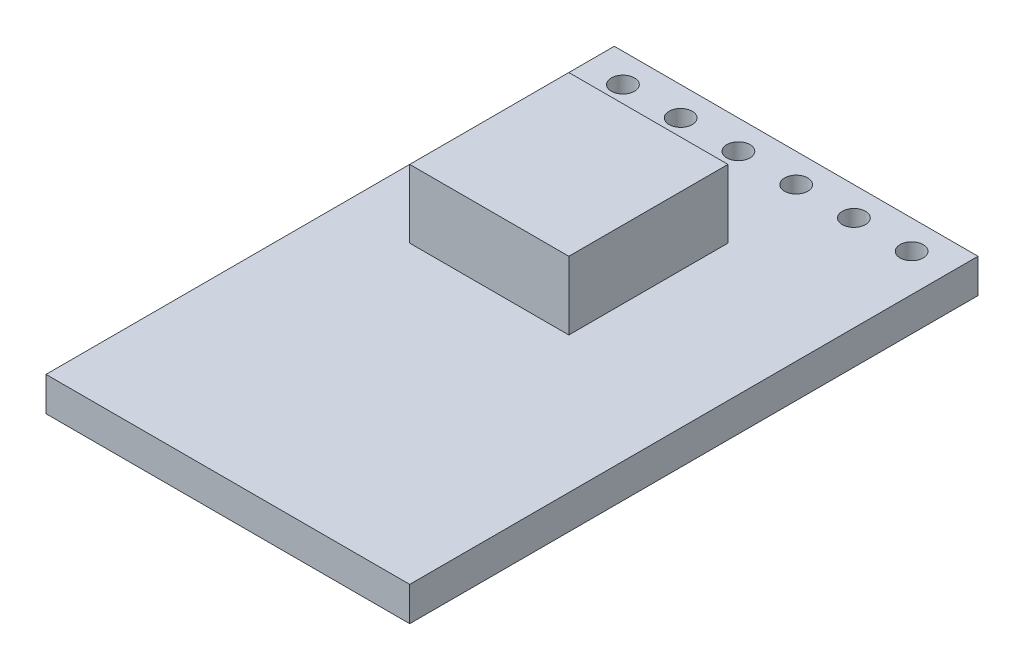
ISO-10303-21;
HEADER;
FILE_DESCRIPTION(('STEP AP214'),'2;1');
FILE_NAME('part.step','',(''),(''),'','','');
FILE_SCHEMA(('AUTOMOTIVE_DESIGN { 1 0 10303 214 1 1 1 1 }'));
ENDSEC;
DATA;
#1=APPLICATION_CONTEXT('core data for automotive mechanical design processes');
#2=APPLICATION_PROTOCOL_DEFINITION('international standard','automotive_design',2000,#1);
#3=PRODUCT_CONTEXT('',#1,'mechanical');
#4=PRODUCT('Part','Part','',(#3));
#5=PRODUCT_RELATED_PRODUCT_CATEGORY('part','',(#4));
#6=PRODUCT_DEFINITION_FORMATION('','',#4);
#7=PRODUCT_DEFINITION_CONTEXT('part definition',#1,'design');
#8=PRODUCT_DEFINITION('design','',#6,#7);
#9=PRODUCT_DEFINITION_SHAPE('','',#8);
#10=(LENGTH_UNIT() NAMED_UNIT(*) SI_UNIT(.MILLI.,.METRE.));
#11=(NAMED_UNIT(*) PLANE_ANGLE_UNIT() SI_UNIT($,.RADIAN.));
#12=(NAMED_UNIT(*) SI_UNIT($,.STERADIAN.) SOLID_ANGLE_UNIT());
#13=UNCERTAINTY_MEASURE_WITH_UNIT(LENGTH_MEASURE(1.E-05),#10,'distance_accuracy_value','');
#14=(GEOMETRIC_REPRESENTATION_CONTEXT(3) GLOBAL_UNCERTAINTY_ASSIGNED_CONTEXT((#13)) GLOBAL_UNIT_ASSIGNED_CONTEXT((#10,
#11,#12)) REPRESENTATION_CONTEXT('',''));
#15=CARTESIAN_POINT('',(0.,0.,0.));
#16=DIRECTION('',(0.,0.,1.));
#17=DIRECTION('',(1.,0.,0.));
#18=AXIS2_PLACEMENT_3D('',#15,#16,#17);
#19=CARTESIAN_POINT('',(0.,1.5,0.));
#20=DIRECTION('',(0.,1.,0.));
#21=DIRECTION('',(0.,0.,1.));
#22=AXIS2_PLACEMENT_3D('',#19,#20,#21);
#23=PLANE('',#22);
#24=CARTESIAN_POINT('',(-14.35,1.5,-23.73));
#25=DIRECTION('',(0.,1.,0.));
#26=DIRECTION('',(0.,0.,1.));
#27=AXIS2_PLACEMENT_3D('',#24,#25,#26);
#28=CIRCLE('',#27,0.51);
#29=CARTESIAN_POINT('',(-14.35,1.5,-23.22));
#30=VERTEX_POINT('',#29);
#31=EDGE_CURVE('E148',#30,#30,#28,.T.);
#32=ORIENTED_EDGE('',*,*,#31,.F.);
#33=EDGE_LOOP('',(#32));
#34=FACE_BOUND('',#33,.T.);
#35=CARTESIAN_POINT('',(-11.81,1.5,-23.73));
#36=DIRECTION('',(0.,1.,0.));
#37=DIRECTION('',(0.,0.,1.));
#38=AXIS2_PLACEMENT_3D('',#35,#36,#37);
#39=CIRCLE('',#38,0.51);
#40=CARTESIAN_POINT('',(-11.81,1.5,-23.22));
#41=VERTEX_POINT('',#40);
#42=EDGE_CURVE('E151',#41,#41,#39,.T.);
#43=ORIENTED_EDGE('',*,*,#42,.F.);
#44=EDGE_LOOP('',(#43));
#45=FACE_BOUND('',#44,.T.);
#46=CARTESIAN_POINT('',(-9.27,1.5,-23.73));
#47=DIRECTION('',(0.,1.,0.));
#48=DIRECTION('',(0.,0.,1.));
#49=AXIS2_PLACEMENT_3D('',#46,#47,#48);
#50=CIRCLE('',#49,0.51);
#51=CARTESIAN_POINT('',(-9.27,1.5,-23.22));
#52=VERTEX_POINT('',#51);
#53=EDGE_CURVE('E157',#52,#52,#50,.T.);
#54=ORIENTED_EDGE('',*,*,#53,.F.);
#55=EDGE_LOOP('',(#54));
#56=FACE_BOUND('',#55,.T.);
#57=CARTESIAN_POINT('',(-6.73,1.5,-23.73));
#58=DIRECTION('',(0.,1.,0.));
#59=DIRECTION('',(0.,0.,1.));
#60=AXIS2_PLACEMENT_3D('',#57,#58,#59);
#61=CIRCLE('',#60,0.51);
#62=CARTESIAN_POINT('',(-6.73,1.5,-23.22));
#63=VERTEX_POINT('',#62);
#64=EDGE_CURVE('E163',#63,#63,#61,.T.);
#65=ORIENTED_EDGE('',*,*,#64,.F.);
#66=EDGE_LOOP('',(#65));
#67=FACE_BOUND('',#66,.T.);
#68=CARTESIAN_POINT('',(-4.19,1.5,-23.73));
#69=DIRECTION('',(0.,1.,0.));
#70=DIRECTION('',(0.,0.,1.));
#71=AXIS2_PLACEMENT_3D('',#68,#69,#70);
#72=CIRCLE('',#71,0.509999999999999);
#73=CARTESIAN_POINT('',(-4.19,1.5,-23.22));
#74=VERTEX_POINT('',#73);
#75=EDGE_CURVE('E169',#74,#74,#72,.T.);
#76=ORIENTED_EDGE('',*,*,#75,.F.);
#77=EDGE_LOOP('',(#76));
#78=FACE_BOUND('',#77,.T.);
#79=CARTESIAN_POINT('',(-1.65,1.5,-23.73));
#80=DIRECTION('',(0.,1.,0.));
#81=DIRECTION('',(0.,0.,1.));
#82=AXIS2_PLACEMENT_3D('',#79,#80,#81);
#83=CIRCLE('',#82,0.509999999999998);
#84=CARTESIAN_POINT('',(-1.65,1.5,-23.22));
#85=VERTEX_POINT('',#84);
#86=EDGE_CURVE('E139',#85,#85,#83,.T.);
#87=ORIENTED_EDGE('',*,*,#86,.F.);
#88=EDGE_LOOP('',(#87));
#89=FACE_BOUND('',#88,.T.);
#90=DIRECTION('',(0.,0.,-1.));
#91=VECTOR('',#90,1.);
#92=CARTESIAN_POINT('',(0.,1.5,0.));
#93=LINE('',#92,#91);
#94=CARTESIAN_POINT('',(0.,1.5,0.));
#95=VERTEX_POINT('',#94);
#96=CARTESIAN_POINT('',(0.,1.5,-25.));
#97=VERTEX_POINT('',#96);
#98=EDGE_CURVE('E177',#95,#97,#93,.T.);
#99=ORIENTED_EDGE('',*,*,#98,.T.);
#100=DIRECTION('',(-1.,0.,0.));
#101=VECTOR('',#100,1.);
#102=CARTESIAN_POINT('',(0.,1.5,-25.));
#103=LINE('',#102,#101);
#104=CARTESIAN_POINT('',(-16.,1.5,-25.));
#105=VERTEX_POINT('',#104);
#106=EDGE_CURVE('E89',#97,#105,#103,.T.);
#107=ORIENTED_EDGE('',*,*,#106,.T.);
#108=DIRECTION('',(0.,0.,1.));
#109=VECTOR('',#108,1.);
#110=CARTESIAN_POINT('',(-16.,1.5,0.));
#111=LINE('',#110,#109);
#112=CARTESIAN_POINT('',(-16.,1.5,0.));
#113=VERTEX_POINT('',#112);
#114=EDGE_CURVE('E180',#105,#113,#111,.T.);
#115=ORIENTED_EDGE('',*,*,#114,.T.);
#116=DIRECTION('',(1.,0.,0.));
#117=VECTOR('',#116,1.);
#118=CARTESIAN_POINT('',(0.,1.5,0.));
#119=LINE('',#118,#117);
#120=EDGE_CURVE('E61',#113,#95,#119,.T.);
#121=ORIENTED_EDGE('',*,*,#120,.T.);
#122=EDGE_LOOP('',(#99,#107,#115,#121));
#123=FACE_BOUND('',#122,.T.);
#124=DIRECTION('',(1.,0.,0.));
#125=VECTOR('',#124,1.);
#126=CARTESIAN_POINT('',(-13.,1.5,-13.));
#127=LINE('',#126,#125);
#128=CARTESIAN_POINT('',(-13.,1.5,-13.));
#129=VERTEX_POINT('',#128);
#130=CARTESIAN_POINT('',(-6.,1.5,-13.));
#131=VERTEX_POINT('',#130);
#132=EDGE_CURVE('E401',#129,#131,#127,.T.);
#133=ORIENTED_EDGE('',*,*,#132,.F.);
#134=DIRECTION('',(0.,0.,1.));
#135=VECTOR('',#134,1.);
#136=CARTESIAN_POINT('',(-13.,1.5,-20.));
#137=LINE('',#136,#135);
#138=CARTESIAN_POINT('',(-13.,1.5,-20.));
#139=VERTEX_POINT('',#138);
#140=EDGE_CURVE('E134',#139,#129,#137,.T.);
#141=ORIENTED_EDGE('',*,*,#140,.F.);
#142=DIRECTION('',(-1.,0.,0.));
#143=VECTOR('',#142,1.);
#144=CARTESIAN_POINT('',(-13.,1.5,-20.));
#145=LINE('',#144,#143);
#146=CARTESIAN_POINT('',(-6.,1.5,-20.));
#147=VERTEX_POINT('',#146);
#148=EDGE_CURVE('E130',#147,#139,#145,.T.);
#149=ORIENTED_EDGE('',*,*,#148,.F.);
#150=DIRECTION('',(0.,0.,-1.));
#151=VECTOR('',#150,1.);
#152=CARTESIAN_POINT('',(-6.,1.5,-20.));
#153=LINE('',#152,#151);
#154=EDGE_CURVE('E398',#131,#147,#153,.T.);
#155=ORIENTED_EDGE('',*,*,#154,.F.);
#156=EDGE_LOOP('',(#133,#141,#149,#155));
#157=FACE_BOUND('',#156,.T.);
#158=ADVANCED_FACE('F37',(#34,#45,#56,#67,#78,#89,#123,#157),#23,.T.);
#159=CARTESIAN_POINT('',(0.,1.5,0.));
#160=DIRECTION('',(-1.,0.,0.));
#161=DIRECTION('',(0.,0.,1.));
#162=AXIS2_PLACEMENT_3D('',#159,#160,#161);
#163=PLANE('',#162);
#164=DIRECTION('',(0.,0.,-1.));
#165=VECTOR('',#164,1.);
#166=CARTESIAN_POINT('',(0.,0.,0.));
#167=LINE('',#166,#165);
#168=CARTESIAN_POINT('',(0.,0.,0.));
#169=VERTEX_POINT('',#168);
#170=CARTESIAN_POINT('',(0.,0.,-25.));
#171=VERTEX_POINT('',#170);
#172=EDGE_CURVE('E147',#169,#171,#167,.T.);
#173=ORIENTED_EDGE('',*,*,#172,.T.);
#174=DIRECTION('',(0.,-1.,0.));
#175=VECTOR('',#174,1.);
#176=CARTESIAN_POINT('',(0.,1.5,-25.));
#177=LINE('',#176,#175);
#178=EDGE_CURVE('E11',#97,#171,#177,.T.);
#179=ORIENTED_EDGE('',*,*,#178,.F.);
#180=ORIENTED_EDGE('',*,*,#98,.F.);
#181=DIRECTION('',(0.,-1.,0.));
#182=VECTOR('',#181,1.);
#183=CARTESIAN_POINT('',(0.,1.5,0.));
#184=LINE('',#183,#182);
#185=EDGE_CURVE('E183',#95,#169,#184,.T.);
#186=ORIENTED_EDGE('',*,*,#185,.T.);
#187=EDGE_LOOP('',(#173,#179,#180,#186));
#188=FACE_BOUND('',#187,.T.);
#189=ADVANCED_FACE('F39',(#188),#163,.F.);
#190=CARTESIAN_POINT('',(0.,1.5,-25.));
#191=DIRECTION('',(0.,0.,1.));
#192=DIRECTION('',(1.,0.,0.));
#193=AXIS2_PLACEMENT_3D('',#190,#191,#192);
#194=PLANE('',#193);
#195=DIRECTION('',(-1.,0.,0.));
#196=VECTOR('',#195,1.);
#197=CARTESIAN_POINT('',(0.,0.,-25.));
#198=LINE('',#197,#196);
#199=CARTESIAN_POINT('',(-16.,0.,-25.));
#200=VERTEX_POINT('',#199);
#201=EDGE_CURVE('E186',#171,#200,#198,.T.);
#202=ORIENTED_EDGE('',*,*,#201,.T.);
#203=DIRECTION('',(0.,-1.,0.));
#204=VECTOR('',#203,1.);
#205=CARTESIAN_POINT('',(-16.,1.5,-25.));
#206=LINE('',#205,#204);
#207=EDGE_CURVE('E45',#105,#200,#206,.T.);
#208=ORIENTED_EDGE('',*,*,#207,.F.);
#209=ORIENTED_EDGE('',*,*,#106,.F.);
#210=ORIENTED_EDGE('',*,*,#178,.T.);
#211=EDGE_LOOP('',(#202,#208,#209,#210));
#212=FACE_BOUND('',#211,.T.);
#213=ADVANCED_FACE('F215',(#212),#194,.F.);
#214=CARTESIAN_POINT('',(-16.,1.5,0.));
#215=DIRECTION('',(1.,0.,0.));
#216=DIRECTION('',(0.,0.,-1.));
#217=AXIS2_PLACEMENT_3D('',#214,#215,#216);
#218=PLANE('',#217);
#219=DIRECTION('',(0.,0.,1.));
#220=VECTOR('',#219,1.);
#221=CARTESIAN_POINT('',(-16.,0.,0.));
#222=LINE('',#221,#220);
#223=CARTESIAN_POINT('',(-16.,0.,0.));
#224=VERTEX_POINT('',#223);
#225=EDGE_CURVE('E188',#200,#224,#222,.T.);
#226=ORIENTED_EDGE('',*,*,#225,.T.);
#227=DIRECTION('',(0.,-1.,0.));
#228=VECTOR('',#227,1.);
#229=CARTESIAN_POINT('',(-16.,1.5,0.));
#230=LINE('',#229,#228);
#231=EDGE_CURVE('E192',#113,#224,#230,.T.);
#232=ORIENTED_EDGE('',*,*,#231,.F.);
#233=ORIENTED_EDGE('',*,*,#114,.F.);
#234=ORIENTED_EDGE('',*,*,#207,.T.);
#235=EDGE_LOOP('',(#226,#232,#233,#234));
#236=FACE_BOUND('',#235,.T.);
#237=ADVANCED_FACE('F197',(#236),#218,.F.);
#238=CARTESIAN_POINT('',(0.,1.5,0.));
#239=DIRECTION('',(0.,0.,-1.));
#240=DIRECTION('',(-1.,0.,0.));
#241=AXIS2_PLACEMENT_3D('',#238,#239,#240);
#242=PLANE('',#241);
#243=DIRECTION('',(1.,0.,0.));
#244=VECTOR('',#243,1.);
#245=CARTESIAN_POINT('',(0.,0.,0.));
#246=LINE('',#245,#244);
#247=EDGE_CURVE('E82',#224,#169,#246,.T.);
#248=ORIENTED_EDGE('',*,*,#247,.T.);
#249=ORIENTED_EDGE('',*,*,#185,.F.);
#250=ORIENTED_EDGE('',*,*,#120,.F.);
#251=ORIENTED_EDGE('',*,*,#231,.T.);
#252=EDGE_LOOP('',(#248,#249,#250,#251));
#253=FACE_BOUND('',#252,.T.);
#254=ADVANCED_FACE('F205',(#253),#242,.F.);
#255=CARTESIAN_POINT('',(0.,0.,0.));
#256=DIRECTION('',(0.,1.,0.));
#257=DIRECTION('',(0.,0.,1.));
#258=AXIS2_PLACEMENT_3D('',#255,#256,#257);
#259=PLANE('',#258);
#260=CARTESIAN_POINT('',(-14.35,0.,-23.73));
#261=DIRECTION('',(0.,1.,0.));
#262=DIRECTION('',(0.,0.,1.));
#263=AXIS2_PLACEMENT_3D('',#260,#261,#262);
#264=CIRCLE('',#263,0.51);
#265=CARTESIAN_POINT('',(-14.35,0.,-23.22));
#266=VERTEX_POINT('',#265);
#267=EDGE_CURVE('E144',#266,#266,#264,.T.);
#268=ORIENTED_EDGE('',*,*,#267,.T.);
#269=EDGE_LOOP('',(#268));
#270=FACE_BOUND('',#269,.T.);
#271=CARTESIAN_POINT('',(-11.81,0.,-23.73));
#272=DIRECTION('',(0.,1.,0.));
#273=DIRECTION('',(0.,0.,1.));
#274=AXIS2_PLACEMENT_3D('',#271,#272,#273);
#275=CIRCLE('',#274,0.51);
#276=CARTESIAN_POINT('',(-11.81,0.,-23.22));
#277=VERTEX_POINT('',#276);
#278=EDGE_CURVE('E154',#277,#277,#275,.T.);
#279=ORIENTED_EDGE('',*,*,#278,.T.);
#280=EDGE_LOOP('',(#279));
#281=FACE_BOUND('',#280,.T.);
#282=CARTESIAN_POINT('',(-9.27,0.,-23.73));
#283=DIRECTION('',(0.,1.,0.));
#284=DIRECTION('',(0.,0.,1.));
#285=AXIS2_PLACEMENT_3D('',#282,#283,#284);
#286=CIRCLE('',#285,0.51);
#287=CARTESIAN_POINT('',(-9.27,0.,-23.22));
#288=VERTEX_POINT('',#287);
#289=EDGE_CURVE('E160',#288,#288,#286,.T.);
#290=ORIENTED_EDGE('',*,*,#289,.T.);
#291=EDGE_LOOP('',(#290));
#292=FACE_BOUND('',#291,.T.);
#293=CARTESIAN_POINT('',(-6.73,0.,-23.73));
#294=DIRECTION('',(0.,1.,0.));
#295=DIRECTION('',(0.,0.,1.));
#296=AXIS2_PLACEMENT_3D('',#293,#294,#295);
#297=CIRCLE('',#296,0.51);
#298=CARTESIAN_POINT('',(-6.73,0.,-23.22));
#299=VERTEX_POINT('',#298);
#300=EDGE_CURVE('E166',#299,#299,#297,.T.);
#301=ORIENTED_EDGE('',*,*,#300,.T.);
#302=EDGE_LOOP('',(#301));
#303=FACE_BOUND('',#302,.T.);
#304=CARTESIAN_POINT('',(-4.19,0.,-23.73));
#305=DIRECTION('',(0.,1.,0.));
#306=DIRECTION('',(0.,0.,1.));
#307=AXIS2_PLACEMENT_3D('',#304,#305,#306);
#308=CIRCLE('',#307,0.509999999999999);
#309=CARTESIAN_POINT('',(-4.19,0.,-23.22));
#310=VERTEX_POINT('',#309);
#311=EDGE_CURVE('E172',#310,#310,#308,.T.);
#312=ORIENTED_EDGE('',*,*,#311,.T.);
#313=EDGE_LOOP('',(#312));
#314=FACE_BOUND('',#313,.T.);
#315=CARTESIAN_POINT('',(-1.65,0.,-23.73));
#316=DIRECTION('',(0.,1.,0.));
#317=DIRECTION('',(0.,0.,1.));
#318=AXIS2_PLACEMENT_3D('',#315,#316,#317);
#319=CIRCLE('',#318,0.509999999999998);
#320=CARTESIAN_POINT('',(-1.65,0.,-23.22));
#321=VERTEX_POINT('',#320);
#322=EDGE_CURVE('E136',#321,#321,#319,.T.);
#323=ORIENTED_EDGE('',*,*,#322,.T.);
#324=EDGE_LOOP('',(#323));
#325=FACE_BOUND('',#324,.T.);
#326=ORIENTED_EDGE('',*,*,#172,.F.);
#327=ORIENTED_EDGE('',*,*,#247,.F.);
#328=ORIENTED_EDGE('',*,*,#225,.F.);
#329=ORIENTED_EDGE('',*,*,#201,.F.);
#330=EDGE_LOOP('',(#326,#327,#328,#329));
#331=FACE_BOUND('',#330,.T.);
#332=ADVANCED_FACE('F201',(#270,#281,#292,#303,#314,#325,#331),#259,.F.);
#333=CARTESIAN_POINT('',(-1.65,0.,-23.73));
#334=DIRECTION('',(0.,1.,0.));
#335=DIRECTION('',(0.,0.,1.));
#336=AXIS2_PLACEMENT_3D('',#333,#334,#335);
#337=CYLINDRICAL_SURFACE('',#336,0.509999999999998);
#338=ORIENTED_EDGE('',*,*,#322,.F.);
#339=EDGE_LOOP('',(#338));
#340=FACE_BOUND('',#339,.T.);
#341=ORIENTED_EDGE('',*,*,#86,.T.);
#342=EDGE_LOOP('',(#341));
#343=FACE_BOUND('',#342,.T.);
#344=ADVANCED_FACE('F212',(#340,#343),#337,.F.);
#345=CARTESIAN_POINT('',(-4.19,0.,-23.73));
#346=DIRECTION('',(0.,1.,0.));
#347=DIRECTION('',(0.,0.,1.));
#348=AXIS2_PLACEMENT_3D('',#345,#346,#347);
#349=CYLINDRICAL_SURFACE('',#348,0.509999999999999);
#350=ORIENTED_EDGE('',*,*,#311,.F.);
#351=EDGE_LOOP('',(#350));
#352=FACE_BOUND('',#351,.T.);
#353=ORIENTED_EDGE('',*,*,#75,.T.);
#354=EDGE_LOOP('',(#353));
#355=FACE_BOUND('',#354,.T.);
#356=ADVANCED_FACE('F228',(#352,#355),#349,.F.);
#357=CARTESIAN_POINT('',(-6.73,0.,-23.73));
#358=DIRECTION('',(0.,1.,0.));
#359=DIRECTION('',(0.,0.,1.));
#360=AXIS2_PLACEMENT_3D('',#357,#358,#359);
#361=CYLINDRICAL_SURFACE('',#360,0.51);
#362=ORIENTED_EDGE('',*,*,#300,.F.);
#363=EDGE_LOOP('',(#362));
#364=FACE_BOUND('',#363,.T.);
#365=ORIENTED_EDGE('',*,*,#64,.T.);
#366=EDGE_LOOP('',(#365));
#367=FACE_BOUND('',#366,.T.);
#368=ADVANCED_FACE('F232',(#364,#367),#361,.F.);
#369=CARTESIAN_POINT('',(-9.27,0.,-23.73));
#370=DIRECTION('',(0.,1.,0.));
#371=DIRECTION('',(0.,0.,1.));
#372=AXIS2_PLACEMENT_3D('',#369,#370,#371);
#373=CYLINDRICAL_SURFACE('',#372,0.51);
#374=ORIENTED_EDGE('',*,*,#289,.F.);
#375=EDGE_LOOP('',(#374));
#376=FACE_BOUND('',#375,.T.);
#377=ORIENTED_EDGE('',*,*,#53,.T.);
#378=EDGE_LOOP('',(#377));
#379=FACE_BOUND('',#378,.T.);
#380=ADVANCED_FACE('F236',(#376,#379),#373,.F.);
#381=CARTESIAN_POINT('',(-11.81,0.,-23.73));
#382=DIRECTION('',(0.,1.,0.));
#383=DIRECTION('',(0.,0.,1.));
#384=AXIS2_PLACEMENT_3D('',#381,#382,#383);
#385=CYLINDRICAL_SURFACE('',#384,0.51);
#386=ORIENTED_EDGE('',*,*,#278,.F.);
#387=EDGE_LOOP('',(#386));
#388=FACE_BOUND('',#387,.T.);
#389=ORIENTED_EDGE('',*,*,#42,.T.);
#390=EDGE_LOOP('',(#389));
#391=FACE_BOUND('',#390,.T.);
#392=ADVANCED_FACE('F240',(#388,#391),#385,.F.);
#393=CARTESIAN_POINT('',(-14.35,0.,-23.73));
#394=DIRECTION('',(0.,1.,0.));
#395=DIRECTION('',(0.,0.,1.));
#396=AXIS2_PLACEMENT_3D('',#393,#394,#395);
#397=CYLINDRICAL_SURFACE('',#396,0.51);
#398=ORIENTED_EDGE('',*,*,#267,.F.);
#399=EDGE_LOOP('',(#398));
#400=FACE_BOUND('',#399,.T.);
#401=ORIENTED_EDGE('',*,*,#31,.T.);
#402=EDGE_LOOP('',(#401));
#403=FACE_BOUND('',#402,.T.);
#404=ADVANCED_FACE('F244',(#400,#403),#397,.F.);
#405=CARTESIAN_POINT('',(-13.,4.5,-20.));
#406=DIRECTION('',(1.,0.,0.));
#407=DIRECTION('',(0.,0.,-1.));
#408=AXIS2_PLACEMENT_3D('',#405,#406,#407);
#409=PLANE('',#408);
#410=ORIENTED_EDGE('',*,*,#140,.T.);
#411=DIRECTION('',(0.,-1.,0.));
#412=VECTOR('',#411,1.);
#413=CARTESIAN_POINT('',(-13.,4.5,-13.));
#414=LINE('',#413,#412);
#415=CARTESIAN_POINT('',(-13.,4.5,-13.));
#416=VERTEX_POINT('',#415);
#417=EDGE_CURVE('E115',#416,#129,#414,.T.);
#418=ORIENTED_EDGE('',*,*,#417,.F.);
#419=DIRECTION('',(0.,0.,1.));
#420=VECTOR('',#419,1.);
#421=CARTESIAN_POINT('',(-13.,4.5,-20.));
#422=LINE('',#421,#420);
#423=CARTESIAN_POINT('',(-13.,4.5,-20.));
#424=VERTEX_POINT('',#423);
#425=EDGE_CURVE('E122',#424,#416,#422,.T.);
#426=ORIENTED_EDGE('',*,*,#425,.F.);
#427=DIRECTION('',(0.,-1.,0.));
#428=VECTOR('',#427,1.);
#429=CARTESIAN_POINT('',(-13.,4.5,-20.));
#430=LINE('',#429,#428);
#431=EDGE_CURVE('E395',#424,#139,#430,.T.);
#432=ORIENTED_EDGE('',*,*,#431,.T.);
#433=EDGE_LOOP('',(#410,#418,#426,#432));
#434=FACE_BOUND('',#433,.T.);
#435=ADVANCED_FACE('F132',(#434),#409,.F.);
#436=CARTESIAN_POINT('',(-13.,4.5,-13.));
#437=DIRECTION('',(0.,0.,-1.));
#438=DIRECTION('',(-1.,0.,0.));
#439=AXIS2_PLACEMENT_3D('',#436,#437,#438);
#440=PLANE('',#439);
#441=ORIENTED_EDGE('',*,*,#132,.T.);
#442=DIRECTION('',(0.,-1.,0.));
#443=VECTOR('',#442,1.);
#444=CARTESIAN_POINT('',(-6.,4.5,-13.));
#445=LINE('',#444,#443);
#446=CARTESIAN_POINT('',(-6.,4.5,-13.));
#447=VERTEX_POINT('',#446);
#448=EDGE_CURVE('E118',#447,#131,#445,.T.);
#449=ORIENTED_EDGE('',*,*,#448,.F.);
#450=DIRECTION('',(1.,0.,0.));
#451=VECTOR('',#450,1.);
#452=CARTESIAN_POINT('',(-13.,4.5,-13.));
#453=LINE('',#452,#451);
#454=EDGE_CURVE('E111',#416,#447,#453,.T.);
#455=ORIENTED_EDGE('',*,*,#454,.F.);
#456=ORIENTED_EDGE('',*,*,#417,.T.);
#457=EDGE_LOOP('',(#441,#449,#455,#456));
#458=FACE_BOUND('',#457,.T.);
#459=ADVANCED_FACE('F113',(#458),#440,.F.);
#460=CARTESIAN_POINT('',(-6.,4.5,-20.));
#461=DIRECTION('',(-1.,0.,0.));
#462=DIRECTION('',(0.,0.,1.));
#463=AXIS2_PLACEMENT_3D('',#460,#461,#462);
#464=PLANE('',#463);
#465=ORIENTED_EDGE('',*,*,#154,.T.);
#466=DIRECTION('',(0.,-1.,0.));
#467=VECTOR('',#466,1.);
#468=CARTESIAN_POINT('',(-6.,4.5,-20.));
#469=LINE('',#468,#467);
#470=CARTESIAN_POINT('',(-6.,4.5,-20.));
#471=VERTEX_POINT('',#470);
#472=EDGE_CURVE('E52',#471,#147,#469,.T.);
#473=ORIENTED_EDGE('',*,*,#472,.F.);
#474=DIRECTION('',(0.,0.,-1.));
#475=VECTOR('',#474,1.);
#476=CARTESIAN_POINT('',(-6.,4.5,-20.));
#477=LINE('',#476,#475);
#478=EDGE_CURVE('E121',#447,#471,#477,.T.);
#479=ORIENTED_EDGE('',*,*,#478,.F.);
#480=ORIENTED_EDGE('',*,*,#448,.T.);
#481=EDGE_LOOP('',(#465,#473,#479,#480));
#482=FACE_BOUND('',#481,.T.);
#483=ADVANCED_FACE('F253',(#482),#464,.F.);
#484=CARTESIAN_POINT('',(-13.,4.5,-20.));
#485=DIRECTION('',(0.,0.,1.));
#486=DIRECTION('',(1.,0.,0.));
#487=AXIS2_PLACEMENT_3D('',#484,#485,#486);
#488=PLANE('',#487);
#489=ORIENTED_EDGE('',*,*,#148,.T.);
#490=ORIENTED_EDGE('',*,*,#431,.F.);
#491=DIRECTION('',(-1.,0.,0.));
#492=VECTOR('',#491,1.);
#493=CARTESIAN_POINT('',(-13.,4.5,-20.));
#494=LINE('',#493,#492);
#495=EDGE_CURVE('E126',#471,#424,#494,.T.);
#496=ORIENTED_EDGE('',*,*,#495,.F.);
#497=ORIENTED_EDGE('',*,*,#472,.T.);
#498=EDGE_LOOP('',(#489,#490,#496,#497));
#499=FACE_BOUND('',#498,.T.);
#500=ADVANCED_FACE('F256',(#499),#488,.F.);
#501=CARTESIAN_POINT('',(0.,4.5,0.));
#502=DIRECTION('',(0.,1.,0.));
#503=DIRECTION('',(0.,0.,1.));
#504=AXIS2_PLACEMENT_3D('',#501,#502,#503);
#505=PLANE('',#504);
#506=ORIENTED_EDGE('',*,*,#425,.T.);
#507=ORIENTED_EDGE('',*,*,#454,.T.);
#508=ORIENTED_EDGE('',*,*,#478,.T.);
#509=ORIENTED_EDGE('',*,*,#495,.T.);
#510=EDGE_LOOP('',(#506,#507,#508,#509));
#511=FACE_BOUND('',#510,.T.);
#512=ADVANCED_FACE('F125',(#511),#505,.T.);
#513=CLOSED_SHELL('',(#158,#189,#213,#237,#254,#332,#344,#356,#368,#380,#392,#404,#435,#459,
#483,#500,#512));
#514=MANIFOLD_SOLID_BREP('B2',#513);
#515=ADVANCED_BREP_SHAPE_REPRESENTATION('',(#18,#514),#14);
#516=SHAPE_DEFINITION_REPRESENTATION(#9,#515);
ENDSEC;
END-ISO-10303-21;
